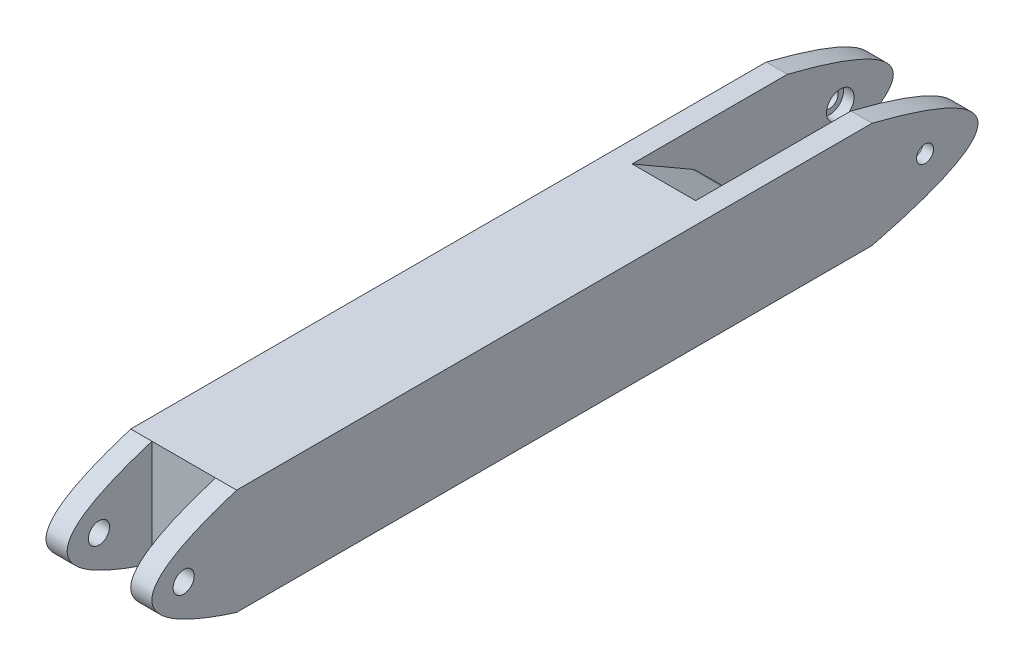
ISO-10303-21;
HEADER;
FILE_DESCRIPTION(('STEP AP214'),'2;1');
FILE_NAME('part.step','',(''),(''),'','','');
FILE_SCHEMA(('AUTOMOTIVE_DESIGN { 1 0 10303 214 1 1 1 1 }'));
ENDSEC;
DATA;
#1=APPLICATION_CONTEXT('core data for automotive mechanical design processes');
#2=APPLICATION_PROTOCOL_DEFINITION('international standard','automotive_design',2000,#1);
#3=PRODUCT_CONTEXT('',#1,'mechanical');
#4=PRODUCT('Part','Part','',(#3));
#5=PRODUCT_RELATED_PRODUCT_CATEGORY('part','',(#4));
#6=PRODUCT_DEFINITION_FORMATION('','',#4);
#7=PRODUCT_DEFINITION_CONTEXT('part definition',#1,'design');
#8=PRODUCT_DEFINITION('design','',#6,#7);
#9=PRODUCT_DEFINITION_SHAPE('','',#8);
#10=(LENGTH_UNIT() NAMED_UNIT(*) SI_UNIT(.MILLI.,.METRE.));
#11=(NAMED_UNIT(*) PLANE_ANGLE_UNIT() SI_UNIT($,.RADIAN.));
#12=(NAMED_UNIT(*) SI_UNIT($,.STERADIAN.) SOLID_ANGLE_UNIT());
#13=UNCERTAINTY_MEASURE_WITH_UNIT(LENGTH_MEASURE(1.E-05),#10,'distance_accuracy_value','');
#14=(GEOMETRIC_REPRESENTATION_CONTEXT(3) GLOBAL_UNCERTAINTY_ASSIGNED_CONTEXT((#13)) GLOBAL_UNIT_ASSIGNED_CONTEXT((#10,
#11,#12)) REPRESENTATION_CONTEXT('',''));
#15=CARTESIAN_POINT('',(0.,0.,0.));
#16=DIRECTION('',(0.,0.,1.));
#17=DIRECTION('',(1.,0.,0.));
#18=AXIS2_PLACEMENT_3D('',#15,#16,#17);
#19=CARTESIAN_POINT('',(50.,17.0460014069889,-69.1285010598986));
#20=DIRECTION('',(-1.,0.,0.));
#21=DIRECTION('',(0.,0.,1.));
#22=AXIS2_PLACEMENT_3D('',#19,#20,#21);
#23=CYLINDRICAL_SURFACE('',#22,4.00000000000002);
#24=CARTESIAN_POINT('',(0.,17.0460014069889,-69.1285010598986));
#25=DIRECTION('',(1.,0.,0.));
#26=DIRECTION('',(0.,0.,-1.));
#27=AXIS2_PLACEMENT_3D('',#24,#25,#26);
#28=CIRCLE('',#27,4.00000000000002);
#29=CARTESIAN_POINT('',(0.,17.0460014069889,-73.1285010598986));
#30=VERTEX_POINT('',#29);
#31=EDGE_CURVE('E221',#30,#30,#28,.T.);
#32=ORIENTED_EDGE('',*,*,#31,.F.);
#33=EDGE_LOOP('',(#32));
#34=FACE_BOUND('',#33,.T.);
#35=CARTESIAN_POINT('',(5.,17.0460014069889,-69.1285010598986));
#36=DIRECTION('',(1.,0.,0.));
#37=DIRECTION('',(0.,0.,-1.));
#38=AXIS2_PLACEMENT_3D('',#35,#36,#37);
#39=CIRCLE('',#38,4.00000000000002);
#40=CARTESIAN_POINT('',(5.,17.0460014069889,-73.1285010598986));
#41=VERTEX_POINT('',#40);
#42=EDGE_CURVE('E43',#41,#41,#39,.T.);
#43=ORIENTED_EDGE('',*,*,#42,.T.);
#44=EDGE_LOOP('',(#43));
#45=FACE_BOUND('',#44,.T.);
#46=ADVANCED_FACE('F39',(#34,#45),#23,.F.);
#47=CARTESIAN_POINT('',(50.,17.0460014069889,-69.1285010598986));
#48=DIRECTION('',(1.,0.,0.));
#49=DIRECTION('',(0.,0.,-1.));
#50=AXIS2_PLACEMENT_3D('',#47,#48,#49);
#51=CIRCLE('',#50,4.00000000000002);
#52=CARTESIAN_POINT('',(50.,17.0460014069889,-73.1285010598986));
#53=VERTEX_POINT('',#52);
#54=EDGE_CURVE('E222',#53,#53,#51,.T.);
#55=ORIENTED_EDGE('',*,*,#54,.T.);
#56=EDGE_LOOP('',(#55));
#57=FACE_BOUND('',#56,.T.);
#58=CARTESIAN_POINT('',(45.,17.0460014069889,-69.1285010598986));
#59=DIRECTION('',(-1.,0.,0.));
#60=DIRECTION('',(0.,0.,1.));
#61=AXIS2_PLACEMENT_3D('',#58,#59,#60);
#62=CIRCLE('',#61,4.00000000000002);
#63=CARTESIAN_POINT('',(45.,17.0460014069889,-65.1285010598986));
#64=VERTEX_POINT('',#63);
#65=EDGE_CURVE('E336',#64,#64,#62,.T.);
#66=ORIENTED_EDGE('',*,*,#65,.T.);
#67=EDGE_LOOP('',(#66));
#68=FACE_BOUND('',#67,.T.);
#69=ADVANCED_FACE('F402',(#57,#68),#23,.F.);
#70=CARTESIAN_POINT('',(50.,42.0460014069818,255.871498940101));
#71=DIRECTION('',(0.,-1.,0.));
#72=DIRECTION('',(0.,0.,-1.));
#73=AXIS2_PLACEMENT_3D('',#70,#71,#72);
#74=PLANE('',#73);
#75=DIRECTION('',(0.,0.,1.));
#76=VECTOR('',#75,1.);
#77=CARTESIAN_POINT('',(40.,42.0460014069818,255.871498940101));
#78=LINE('',#77,#76);
#79=CARTESIAN_POINT('',(40.,42.0460014069818,-44.1285010598986));
#80=VERTEX_POINT('',#79);
#81=CARTESIAN_POINT('',(40.,42.0460014069818,29.1727691293236));
#82=VERTEX_POINT('',#81);
#83=EDGE_CURVE('E193',#80,#82,#78,.T.);
#84=ORIENTED_EDGE('',*,*,#83,.T.);
#85=DIRECTION('',(-1.,0.,0.));
#86=VECTOR('',#85,1.);
#87=CARTESIAN_POINT('',(40.,42.0460014069818,29.1727691293236));
#88=LINE('',#87,#86);
#89=CARTESIAN_POINT('',(10.,42.0460014069818,29.1727691293236));
#90=VERTEX_POINT('',#89);
#91=EDGE_CURVE('E161',#82,#90,#88,.T.);
#92=ORIENTED_EDGE('',*,*,#91,.T.);
#93=DIRECTION('',(0.,0.,-1.));
#94=VECTOR('',#93,1.);
#95=CARTESIAN_POINT('',(10.,42.0460014069818,255.871498940101));
#96=LINE('',#95,#94);
#97=CARTESIAN_POINT('',(10.,42.0460014069818,-44.1285010598986));
#98=VERTEX_POINT('',#97);
#99=EDGE_CURVE('E141',#90,#98,#96,.T.);
#100=ORIENTED_EDGE('',*,*,#99,.T.);
#101=DIRECTION('',(-1.,0.,0.));
#102=VECTOR('',#101,1.);
#103=CARTESIAN_POINT('',(50.,42.0460014069818,-44.1285010598985));
#104=LINE('',#103,#102);
#105=CARTESIAN_POINT('',(0.,42.0460014069818,-44.1285010598985));
#106=VERTEX_POINT('',#105);
#107=EDGE_CURVE('E308',#98,#106,#104,.T.);
#108=ORIENTED_EDGE('',*,*,#107,.T.);
#109=DIRECTION('',(0.,0.,1.));
#110=VECTOR('',#109,1.);
#111=CARTESIAN_POINT('',(0.,42.0460014069818,255.871498940101));
#112=LINE('',#111,#110);
#113=CARTESIAN_POINT('',(0.,42.0460014069818,255.871498940101));
#114=VERTEX_POINT('',#113);
#115=EDGE_CURVE('E246',#106,#114,#112,.T.);
#116=ORIENTED_EDGE('',*,*,#115,.T.);
#117=DIRECTION('',(-1.,0.,0.));
#118=VECTOR('',#117,1.);
#119=CARTESIAN_POINT('',(50.,42.0460014069818,255.871498940101));
#120=LINE('',#119,#118);
#121=CARTESIAN_POINT('',(10.,42.0460014069818,255.871498940101));
#122=VERTEX_POINT('',#121);
#123=EDGE_CURVE('E279',#122,#114,#120,.T.);
#124=ORIENTED_EDGE('',*,*,#123,.F.);
#125=CARTESIAN_POINT('',(40.,42.0460014069818,255.871498940101));
#126=VERTEX_POINT('',#125);
#127=EDGE_CURVE('E309',#126,#122,#120,.T.);
#128=ORIENTED_EDGE('',*,*,#127,.F.);
#129=CARTESIAN_POINT('',(50.,42.0460014069818,255.871498940101));
#130=VERTEX_POINT('',#129);
#131=EDGE_CURVE('E304',#130,#126,#120,.T.);
#132=ORIENTED_EDGE('',*,*,#131,.F.);
#133=DIRECTION('',(0.,0.,1.));
#134=VECTOR('',#133,1.);
#135=CARTESIAN_POINT('',(50.,42.0460014069818,255.871498940101));
#136=LINE('',#135,#134);
#137=CARTESIAN_POINT('',(50.,42.0460014069818,-44.1285010598985));
#138=VERTEX_POINT('',#137);
#139=EDGE_CURVE('E273',#138,#130,#136,.T.);
#140=ORIENTED_EDGE('',*,*,#139,.F.);
#141=EDGE_CURVE('E310',#138,#80,#104,.T.);
#142=ORIENTED_EDGE('',*,*,#141,.T.);
#143=EDGE_LOOP('',(#84,#92,#100,#108,#116,#124,#128,#132,#140,#142));
#144=FACE_BOUND('',#143,.T.);
#145=ADVANCED_FACE('F265',(#144),#74,.F.);
#146=CARTESIAN_POINT('',(50.,42.0460014069818,255.871498940101));
#147=CARTESIAN_POINT('',(50.,17.0460014071354,335.871498940101));
#148=CARTESIAN_POINT('',(50.,-7.95399859301822,255.871498940101));
#149=B_SPLINE_CURVE_WITH_KNOTS('',2,(#146,#147,#148),.UNSPECIFIED.,.F.,.F.,(3,3),(0.,1.),.UNSPECIFIED.);
#150=DIRECTION('',(-1.,0.,0.));
#151=VECTOR('',#150,1.);
#152=SURFACE_OF_LINEAR_EXTRUSION('',#149,#151);
#153=DIRECTION('',(-1.,0.,0.));
#154=VECTOR('',#153,1.);
#155=CARTESIAN_POINT('',(50.,-7.95399859301822,255.871498940101));
#156=LINE('',#155,#154);
#157=CARTESIAN_POINT('',(10.,-7.95399859301822,255.871498940101));
#158=VERTEX_POINT('',#157);
#159=CARTESIAN_POINT('',(0.,-7.95399859301822,255.871498940101));
#160=VERTEX_POINT('',#159);
#161=EDGE_CURVE('E318',#158,#160,#156,.T.);
#162=ORIENTED_EDGE('',*,*,#161,.F.);
#163=CARTESIAN_POINT('',(10.,42.0460014069818,255.871498940101));
#164=CARTESIAN_POINT('',(10.,17.0460014071354,335.871498940101));
#165=CARTESIAN_POINT('',(10.,-7.95399859301822,255.871498940101));
#166=B_SPLINE_CURVE_WITH_KNOTS('',2,(#163,#164,#165),.UNSPECIFIED.,.F.,.F.,(3,3),(0.,1.),.UNSPECIFIED.);
#167=EDGE_CURVE('E185',#158,#122,#166,.F.);
#168=ORIENTED_EDGE('',*,*,#167,.T.);
#169=ORIENTED_EDGE('',*,*,#123,.T.);
#170=CARTESIAN_POINT('',(0.,42.0460014069818,255.871498940101));
#171=CARTESIAN_POINT('',(0.,17.0460014071354,335.871498940101));
#172=CARTESIAN_POINT('',(0.,-7.95399859301822,255.871498940101));
#173=B_SPLINE_CURVE_WITH_KNOTS('',2,(#170,#171,#172),.UNSPECIFIED.,.F.,.F.,(3,3),(0.,1.),.UNSPECIFIED.);
#174=EDGE_CURVE('E234',#114,#160,#173,.T.);
#175=ORIENTED_EDGE('',*,*,#174,.T.);
#176=EDGE_LOOP('',(#162,#168,#169,#175));
#177=FACE_BOUND('',#176,.T.);
#178=ADVANCED_FACE('F256',(#177),#152,.F.);
#179=CARTESIAN_POINT('',(50.,17.0460014070886,280.871498940101));
#180=DIRECTION('',(-1.,0.,0.));
#181=DIRECTION('',(0.,0.,1.));
#182=AXIS2_PLACEMENT_3D('',#179,#180,#181);
#183=CYLINDRICAL_SURFACE('',#182,4.99999999999999);
#184=CARTESIAN_POINT('',(10.,17.0460014070886,280.871498940101));
#185=DIRECTION('',(-1.,0.,0.));
#186=DIRECTION('',(0.,0.,1.));
#187=AXIS2_PLACEMENT_3D('',#184,#185,#186);
#188=CIRCLE('',#187,4.99999999999999);
#189=CARTESIAN_POINT('',(10.,17.0460014070886,285.871498940101));
#190=VERTEX_POINT('',#189);
#191=EDGE_CURVE('E184',#190,#190,#188,.T.);
#192=ORIENTED_EDGE('',*,*,#191,.F.);
#193=EDGE_LOOP('',(#192));
#194=FACE_BOUND('',#193,.T.);
#195=CARTESIAN_POINT('',(0.,17.0460014070886,280.871498940101));
#196=DIRECTION('',(1.,0.,0.));
#197=DIRECTION('',(0.,0.,-1.));
#198=AXIS2_PLACEMENT_3D('',#195,#196,#197);
#199=CIRCLE('',#198,4.99999999999999);
#200=CARTESIAN_POINT('',(0.,17.0460014070886,275.871498940101));
#201=VERTEX_POINT('',#200);
#202=EDGE_CURVE('E226',#201,#201,#199,.T.);
#203=ORIENTED_EDGE('',*,*,#202,.F.);
#204=EDGE_LOOP('',(#203));
#205=FACE_BOUND('',#204,.T.);
#206=ADVANCED_FACE('F478',(#194,#205),#183,.F.);
#207=CARTESIAN_POINT('',(50.,-7.95399859301822,-44.1285010598985));
#208=CARTESIAN_POINT('',(50.,17.0460014069818,-144.128501059899));
#209=CARTESIAN_POINT('',(50.,42.0460014069818,-44.1285010598985));
#210=B_SPLINE_CURVE_WITH_KNOTS('',2,(#207,#208,#209),.UNSPECIFIED.,.F.,.F.,(3,3),(0.,1.),.UNSPECIFIED.);
#211=DIRECTION('',(-1.,0.,0.));
#212=VECTOR('',#211,1.);
#213=SURFACE_OF_LINEAR_EXTRUSION('',#210,#212);
#214=ORIENTED_EDGE('',*,*,#107,.F.);
#215=CARTESIAN_POINT('',(10.,-7.95399859301822,-44.1285010598985));
#216=CARTESIAN_POINT('',(10.,17.0460014069818,-144.128501059899));
#217=CARTESIAN_POINT('',(10.,42.0460014069818,-44.1285010598985));
#218=B_SPLINE_CURVE_WITH_KNOTS('',2,(#215,#216,#217),.UNSPECIFIED.,.F.,.F.,(3,3),(0.,1.),.UNSPECIFIED.);
#219=CARTESIAN_POINT('',(10.,-7.95399859301822,-44.1285010598985));
#220=VERTEX_POINT('',#219);
#221=EDGE_CURVE('E210',#98,#220,#218,.F.);
#222=ORIENTED_EDGE('',*,*,#221,.T.);
#223=DIRECTION('',(-1.,0.,0.));
#224=VECTOR('',#223,1.);
#225=CARTESIAN_POINT('',(50.,-7.95399859301822,-44.1285010598985));
#226=LINE('',#225,#224);
#227=CARTESIAN_POINT('',(0.,-7.95399859301822,-44.1285010598985));
#228=VERTEX_POINT('',#227);
#229=EDGE_CURVE('E314',#220,#228,#226,.T.);
#230=ORIENTED_EDGE('',*,*,#229,.T.);
#231=CARTESIAN_POINT('',(0.,-7.95399859301822,-44.1285010598985));
#232=CARTESIAN_POINT('',(0.,17.0460014069818,-144.128501059899));
#233=CARTESIAN_POINT('',(0.,42.0460014069818,-44.1285010598985));
#234=B_SPLINE_CURVE_WITH_KNOTS('',2,(#231,#232,#233),.UNSPECIFIED.,.F.,.F.,(3,3),(0.,1.),.UNSPECIFIED.);
#235=EDGE_CURVE('E292',#228,#106,#234,.T.);
#236=ORIENTED_EDGE('',*,*,#235,.T.);
#237=EDGE_LOOP('',(#214,#222,#230,#236));
#238=FACE_BOUND('',#237,.T.);
#239=ADVANCED_FACE('F264',(#238),#213,.F.);
#240=CARTESIAN_POINT('',(50.,17.0460014070586,295.871498940101));
#241=DIRECTION('',(-1.,0.,0.));
#242=DIRECTION('',(0.,0.,1.));
#243=AXIS2_PLACEMENT_3D('',#240,#241,#242);
#244=PLANE('',#243);
#245=CARTESIAN_POINT('',(50.,-7.95399859301822,255.871498940101));
#246=VERTEX_POINT('',#245);
#247=EDGE_CURVE('E238',#130,#246,#149,.T.);
#248=ORIENTED_EDGE('',*,*,#247,.T.);
#249=DIRECTION('',(0.,0.,-1.));
#250=VECTOR('',#249,1.);
#251=CARTESIAN_POINT('',(50.,-7.95399859301822,255.871498940101));
#252=LINE('',#251,#250);
#253=CARTESIAN_POINT('',(50.,-7.95399859301822,-44.1285010598985));
#254=VERTEX_POINT('',#253);
#255=EDGE_CURVE('E245',#246,#254,#252,.T.);
#256=ORIENTED_EDGE('',*,*,#255,.T.);
#257=EDGE_CURVE('E267',#254,#138,#210,.T.);
#258=ORIENTED_EDGE('',*,*,#257,.T.);
#259=ORIENTED_EDGE('',*,*,#139,.T.);
#260=EDGE_LOOP('',(#248,#256,#258,#259));
#261=FACE_BOUND('',#260,.T.);
#262=CARTESIAN_POINT('',(50.,17.0460014070886,280.871498940101));
#263=DIRECTION('',(1.,0.,0.));
#264=DIRECTION('',(0.,0.,-1.));
#265=AXIS2_PLACEMENT_3D('',#262,#263,#264);
#266=CIRCLE('',#265,4.99999999999999);
#267=CARTESIAN_POINT('',(50.,17.0460014070886,275.871498940101));
#268=VERTEX_POINT('',#267);
#269=EDGE_CURVE('E230',#268,#268,#266,.T.);
#270=ORIENTED_EDGE('',*,*,#269,.F.);
#271=EDGE_LOOP('',(#270));
#272=FACE_BOUND('',#271,.T.);
#273=ORIENTED_EDGE('',*,*,#54,.F.);
#274=EDGE_LOOP('',(#273));
#275=FACE_BOUND('',#274,.T.);
#276=ADVANCED_FACE('F389',(#261,#272,#275),#244,.F.);
#277=CARTESIAN_POINT('',(0.,17.0460014070586,295.871498940101));
#278=DIRECTION('',(-1.,0.,0.));
#279=DIRECTION('',(0.,0.,1.));
#280=AXIS2_PLACEMENT_3D('',#277,#278,#279);
#281=PLANE('',#280);
#282=CARTESIAN_POINT('',(0.,27.0460014069889,15.8714989401014));
#283=DIRECTION('',(-1.,0.,0.));
#284=DIRECTION('',(0.,0.,1.));
#285=AXIS2_PLACEMENT_3D('',#282,#283,#284);
#286=CIRCLE('',#285,3.);
#287=CARTESIAN_POINT('',(0.,27.0460014069889,18.8714989401014));
#288=VERTEX_POINT('',#287);
#289=EDGE_CURVE('E370',#288,#288,#286,.T.);
#290=ORIENTED_EDGE('',*,*,#289,.F.);
#291=EDGE_LOOP('',(#290));
#292=FACE_BOUND('',#291,.T.);
#293=CARTESIAN_POINT('',(0.,7.0460014069889,15.8714989401014));
#294=DIRECTION('',(-1.,0.,0.));
#295=DIRECTION('',(0.,0.,-1.));
#296=AXIS2_PLACEMENT_3D('',#293,#294,#295);
#297=CIRCLE('',#296,3.);
#298=CARTESIAN_POINT('',(0.,7.0460014069889,12.8714989401014));
#299=VERTEX_POINT('',#298);
#300=EDGE_CURVE('E362',#299,#299,#297,.T.);
#301=ORIENTED_EDGE('',*,*,#300,.F.);
#302=EDGE_LOOP('',(#301));
#303=FACE_BOUND('',#302,.T.);
#304=ORIENTED_EDGE('',*,*,#202,.T.);
#305=EDGE_LOOP('',(#304));
#306=FACE_BOUND('',#305,.T.);
#307=ORIENTED_EDGE('',*,*,#174,.F.);
#308=ORIENTED_EDGE('',*,*,#115,.F.);
#309=ORIENTED_EDGE('',*,*,#235,.F.);
#310=DIRECTION('',(0.,0.,-1.));
#311=VECTOR('',#310,1.);
#312=CARTESIAN_POINT('',(0.,-7.95399859301822,255.871498940101));
#313=LINE('',#312,#311);
#314=EDGE_CURVE('E285',#160,#228,#313,.T.);
#315=ORIENTED_EDGE('',*,*,#314,.F.);
#316=EDGE_LOOP('',(#307,#308,#309,#315));
#317=FACE_BOUND('',#316,.T.);
#318=ORIENTED_EDGE('',*,*,#31,.T.);
#319=EDGE_LOOP('',(#318));
#320=FACE_BOUND('',#319,.T.);
#321=ADVANCED_FACE('F254',(#292,#303,#306,#317,#320),#281,.T.);
#322=ORIENTED_EDGE('',*,*,#131,.T.);
#323=CARTESIAN_POINT('',(40.,42.0460014069818,255.871498940101));
#324=CARTESIAN_POINT('',(40.,17.0460014071354,335.871498940101));
#325=CARTESIAN_POINT('',(40.,-7.95399859301822,255.871498940101));
#326=B_SPLINE_CURVE_WITH_KNOTS('',2,(#323,#324,#325),.UNSPECIFIED.,.F.,.F.,(3,3),(0.,1.),.UNSPECIFIED.);
#327=CARTESIAN_POINT('',(40.,-7.95399859301822,255.871498940101));
#328=VERTEX_POINT('',#327);
#329=EDGE_CURVE('E179',#126,#328,#326,.T.);
#330=ORIENTED_EDGE('',*,*,#329,.T.);
#331=EDGE_CURVE('E319',#246,#328,#156,.T.);
#332=ORIENTED_EDGE('',*,*,#331,.F.);
#333=ORIENTED_EDGE('',*,*,#247,.F.);
#334=EDGE_LOOP('',(#322,#330,#332,#333));
#335=FACE_BOUND('',#334,.T.);
#336=ADVANCED_FACE('F251',(#335),#152,.F.);
#337=CARTESIAN_POINT('',(50.,-7.95399859301822,255.871498940101));
#338=DIRECTION('',(0.,1.,0.));
#339=DIRECTION('',(0.,0.,1.));
#340=AXIS2_PLACEMENT_3D('',#337,#338,#339);
#341=PLANE('',#340);
#342=DIRECTION('',(-1.,0.,0.));
#343=VECTOR('',#342,1.);
#344=CARTESIAN_POINT('',(40.,-7.95399859301822,29.1727691293229));
#345=LINE('',#344,#343);
#346=CARTESIAN_POINT('',(40.,-7.95399859301822,29.1727691293229));
#347=VERTEX_POINT('',#346);
#348=CARTESIAN_POINT('',(10.,-7.95399859301822,29.1727691293229));
#349=VERTEX_POINT('',#348);
#350=EDGE_CURVE('E145',#347,#349,#345,.T.);
#351=ORIENTED_EDGE('',*,*,#350,.F.);
#352=DIRECTION('',(0.,0.,-1.));
#353=VECTOR('',#352,1.);
#354=CARTESIAN_POINT('',(40.,-7.95399859301822,255.871498940101));
#355=LINE('',#354,#353);
#356=CARTESIAN_POINT('',(40.,-7.95399859301822,-44.1285010598985));
#357=VERTEX_POINT('',#356);
#358=EDGE_CURVE('E130',#347,#357,#355,.T.);
#359=ORIENTED_EDGE('',*,*,#358,.T.);
#360=EDGE_CURVE('E315',#254,#357,#226,.T.);
#361=ORIENTED_EDGE('',*,*,#360,.F.);
#362=ORIENTED_EDGE('',*,*,#255,.F.);
#363=ORIENTED_EDGE('',*,*,#331,.T.);
#364=DIRECTION('',(1.,0.,0.));
#365=VECTOR('',#364,1.);
#366=CARTESIAN_POINT('',(10.,-7.95399859301822,255.871498940101));
#367=LINE('',#366,#365);
#368=EDGE_CURVE('E166',#158,#328,#367,.T.);
#369=ORIENTED_EDGE('',*,*,#368,.F.);
#370=ORIENTED_EDGE('',*,*,#161,.T.);
#371=ORIENTED_EDGE('',*,*,#314,.T.);
#372=ORIENTED_EDGE('',*,*,#229,.F.);
#373=DIRECTION('',(0.,0.,1.));
#374=VECTOR('',#373,1.);
#375=CARTESIAN_POINT('',(10.,-7.95399859301822,255.871498940101));
#376=LINE('',#375,#374);
#377=EDGE_CURVE('E151',#220,#349,#376,.T.);
#378=ORIENTED_EDGE('',*,*,#377,.T.);
#379=EDGE_LOOP('',(#351,#359,#361,#362,#363,#369,#370,#371,#372,#378));
#380=FACE_BOUND('',#379,.T.);
#381=ADVANCED_FACE('F149',(#380),#341,.F.);
#382=ORIENTED_EDGE('',*,*,#360,.T.);
#383=CARTESIAN_POINT('',(40.,-7.95399859301822,-44.1285010598985));
#384=CARTESIAN_POINT('',(40.,17.0460014069818,-144.128501059899));
#385=CARTESIAN_POINT('',(40.,42.0460014069818,-44.1285010598985));
#386=B_SPLINE_CURVE_WITH_KNOTS('',2,(#383,#384,#385),.UNSPECIFIED.,.F.,.F.,(3,3),(0.,1.),.UNSPECIFIED.);
#387=EDGE_CURVE('E135',#357,#80,#386,.T.);
#388=ORIENTED_EDGE('',*,*,#387,.T.);
#389=ORIENTED_EDGE('',*,*,#141,.F.);
#390=ORIENTED_EDGE('',*,*,#257,.F.);
#391=EDGE_LOOP('',(#382,#388,#389,#390));
#392=FACE_BOUND('',#391,.T.);
#393=ADVANCED_FACE('F259',(#392),#213,.F.);
#394=CARTESIAN_POINT('',(40.,17.0460014070886,280.871498940101));
#395=DIRECTION('',(1.,0.,0.));
#396=DIRECTION('',(0.,0.,-1.));
#397=AXIS2_PLACEMENT_3D('',#394,#395,#396);
#398=CIRCLE('',#397,4.99999999999999);
#399=CARTESIAN_POINT('',(40.,17.0460014070886,275.871498940101));
#400=VERTEX_POINT('',#399);
#401=EDGE_CURVE('E175',#400,#400,#398,.T.);
#402=ORIENTED_EDGE('',*,*,#401,.F.);
#403=EDGE_LOOP('',(#402));
#404=FACE_BOUND('',#403,.T.);
#405=ORIENTED_EDGE('',*,*,#269,.T.);
#406=EDGE_LOOP('',(#405));
#407=FACE_BOUND('',#406,.T.);
#408=ADVANCED_FACE('F262',(#404,#407),#183,.F.);
#409=CARTESIAN_POINT('',(10.,-35.,-94.1285010598986));
#410=DIRECTION('',(-1.,0.,0.));
#411=DIRECTION('',(0.,0.,1.));
#412=AXIS2_PLACEMENT_3D('',#409,#410,#411);
#413=PLANE('',#412);
#414=CARTESIAN_POINT('',(10.,17.0460014069889,-69.1285010598986));
#415=DIRECTION('',(1.,0.,0.));
#416=DIRECTION('',(0.,0.,-1.));
#417=AXIS2_PLACEMENT_3D('',#414,#415,#416);
#418=CIRCLE('',#417,6.49999999999783);
#419=CARTESIAN_POINT('',(10.,17.0460014069889,-75.6285010598964));
#420=VERTEX_POINT('',#419);
#421=EDGE_CURVE('E353',#420,#420,#418,.T.);
#422=ORIENTED_EDGE('',*,*,#421,.F.);
#423=EDGE_LOOP('',(#422));
#424=FACE_BOUND('',#423,.T.);
#425=ORIENTED_EDGE('',*,*,#221,.F.);
#426=ORIENTED_EDGE('',*,*,#99,.F.);
#427=DIRECTION('',(0.,0.499999999999998,0.86602540378444));
#428=VECTOR('',#427,1.);
#429=CARTESIAN_POINT('',(10.,17.0460014069818,-14.1285010598985));
#430=LINE('',#429,#428);
#431=CARTESIAN_POINT('',(10.,25.7062554448261,0.871498940101433));
#432=VERTEX_POINT('',#431);
#433=EDGE_CURVE('E153',#432,#90,#430,.T.);
#434=ORIENTED_EDGE('',*,*,#433,.F.);
#435=CARTESIAN_POINT('',(10.,17.0460014069817,5.87149894010141));
#436=DIRECTION('',(-1.,0.,0.));
#437=DIRECTION('',(0.,0.,1.));
#438=AXIS2_PLACEMENT_3D('',#435,#436,#437);
#439=CIRCLE('',#438,10.);
#440=CARTESIAN_POINT('',(10.,8.38574736913734,0.871498940101372));
#441=VERTEX_POINT('',#440);
#442=EDGE_CURVE('E49',#432,#441,#439,.T.);
#443=ORIENTED_EDGE('',*,*,#442,.T.);
#444=DIRECTION('',(0.,0.500000000000004,-0.866025403784436));
#445=VECTOR('',#444,1.);
#446=CARTESIAN_POINT('',(10.,17.0460014069818,-14.1285010598985));
#447=LINE('',#446,#445);
#448=EDGE_CURVE('E147',#349,#441,#447,.T.);
#449=ORIENTED_EDGE('',*,*,#448,.F.);
#450=ORIENTED_EDGE('',*,*,#377,.F.);
#451=EDGE_LOOP('',(#425,#426,#434,#443,#449,#450));
#452=FACE_BOUND('',#451,.T.);
#453=ADVANCED_FACE('F422',(#424,#452),#413,.F.);
#454=CARTESIAN_POINT('',(40.,-35.,-94.1285010598986));
#455=DIRECTION('',(1.,0.,0.));
#456=DIRECTION('',(0.,0.,-1.));
#457=AXIS2_PLACEMENT_3D('',#454,#455,#456);
#458=PLANE('',#457);
#459=CARTESIAN_POINT('',(40.,17.0460014069889,-69.1285010598986));
#460=DIRECTION('',(-1.,0.,0.));
#461=DIRECTION('',(0.,0.,1.));
#462=AXIS2_PLACEMENT_3D('',#459,#460,#461);
#463=CIRCLE('',#462,6.49999999999801);
#464=CARTESIAN_POINT('',(40.,17.0460014069889,-62.6285010599006));
#465=VERTEX_POINT('',#464);
#466=EDGE_CURVE('E345',#465,#465,#463,.T.);
#467=ORIENTED_EDGE('',*,*,#466,.F.);
#468=EDGE_LOOP('',(#467));
#469=FACE_BOUND('',#468,.T.);
#470=ORIENTED_EDGE('',*,*,#358,.F.);
#471=DIRECTION('',(0.,0.500000000000004,-0.866025403784436));
#472=VECTOR('',#471,1.);
#473=CARTESIAN_POINT('',(40.,17.0460014069818,-14.1285010598985));
#474=LINE('',#473,#472);
#475=CARTESIAN_POINT('',(40.,8.38574736913734,0.871498940101372));
#476=VERTEX_POINT('',#475);
#477=EDGE_CURVE('E132',#347,#476,#474,.T.);
#478=ORIENTED_EDGE('',*,*,#477,.T.);
#479=CARTESIAN_POINT('',(40.,17.0460014069817,5.87149894010141));
#480=DIRECTION('',(1.,0.,0.));
#481=DIRECTION('',(0.,0.,-1.));
#482=AXIS2_PLACEMENT_3D('',#479,#480,#481);
#483=CIRCLE('',#482,10.);
#484=CARTESIAN_POINT('',(40.,25.7062554448261,0.871498940101433));
#485=VERTEX_POINT('',#484);
#486=EDGE_CURVE('E11',#476,#485,#483,.T.);
#487=ORIENTED_EDGE('',*,*,#486,.T.);
#488=DIRECTION('',(0.,0.499999999999998,0.86602540378444));
#489=VECTOR('',#488,1.);
#490=CARTESIAN_POINT('',(40.,17.0460014069818,-14.1285010598985));
#491=LINE('',#490,#489);
#492=EDGE_CURVE('E156',#485,#82,#491,.T.);
#493=ORIENTED_EDGE('',*,*,#492,.T.);
#494=ORIENTED_EDGE('',*,*,#83,.F.);
#495=ORIENTED_EDGE('',*,*,#387,.F.);
#496=EDGE_LOOP('',(#470,#478,#487,#493,#494,#495));
#497=FACE_BOUND('',#496,.T.);
#498=ADVANCED_FACE('F131',(#469,#497),#458,.F.);
#499=CARTESIAN_POINT('',(10.,44.0460014069818,255.871498940101));
#500=DIRECTION('',(0.,0.,-1.));
#501=DIRECTION('',(-1.,0.,0.));
#502=AXIS2_PLACEMENT_3D('',#499,#500,#501);
#503=PLANE('',#502);
#504=DIRECTION('',(0.,-1.,0.));
#505=VECTOR('',#504,1.);
#506=CARTESIAN_POINT('',(10.,44.0460014069818,255.871498940101));
#507=LINE('',#506,#505);
#508=EDGE_CURVE('E170',#122,#158,#507,.T.);
#509=ORIENTED_EDGE('',*,*,#508,.T.);
#510=ORIENTED_EDGE('',*,*,#368,.T.);
#511=DIRECTION('',(0.,-1.,0.));
#512=VECTOR('',#511,1.);
#513=CARTESIAN_POINT('',(40.,44.0460014069818,255.871498940101));
#514=LINE('',#513,#512);
#515=EDGE_CURVE('E171',#126,#328,#514,.T.);
#516=ORIENTED_EDGE('',*,*,#515,.F.);
#517=ORIENTED_EDGE('',*,*,#127,.T.);
#518=EDGE_LOOP('',(#509,#510,#516,#517));
#519=FACE_BOUND('',#518,.T.);
#520=ADVANCED_FACE('F451',(#519),#503,.F.);
#521=CARTESIAN_POINT('',(10.,44.0460014069818,295.871498940101));
#522=DIRECTION('',(-1.,0.,0.));
#523=DIRECTION('',(0.,0.,1.));
#524=AXIS2_PLACEMENT_3D('',#521,#522,#523);
#525=PLANE('',#524);
#526=ORIENTED_EDGE('',*,*,#191,.T.);
#527=EDGE_LOOP('',(#526));
#528=FACE_BOUND('',#527,.T.);
#529=ORIENTED_EDGE('',*,*,#508,.F.);
#530=ORIENTED_EDGE('',*,*,#167,.F.);
#531=EDGE_LOOP('',(#529,#530));
#532=FACE_BOUND('',#531,.T.);
#533=ADVANCED_FACE('F456',(#528,#532),#525,.F.);
#534=CARTESIAN_POINT('',(40.,44.0460014069818,295.871498940101));
#535=DIRECTION('',(1.,0.,0.));
#536=DIRECTION('',(0.,0.,-1.));
#537=AXIS2_PLACEMENT_3D('',#534,#535,#536);
#538=PLANE('',#537);
#539=ORIENTED_EDGE('',*,*,#401,.T.);
#540=EDGE_LOOP('',(#539));
#541=FACE_BOUND('',#540,.T.);
#542=ORIENTED_EDGE('',*,*,#515,.T.);
#543=ORIENTED_EDGE('',*,*,#329,.F.);
#544=EDGE_LOOP('',(#542,#543));
#545=FACE_BOUND('',#544,.T.);
#546=ADVANCED_FACE('F458',(#541,#545),#538,.F.);
#547=CARTESIAN_POINT('',(40.,17.0460014069818,-14.1285010598985));
#548=DIRECTION('',(0.,-0.86602540378444,0.499999999999998));
#549=DIRECTION('',(0.,-0.499999999999998,-0.86602540378444));
#550=AXIS2_PLACEMENT_3D('',#547,#548,#549);
#551=PLANE('',#550);
#552=ORIENTED_EDGE('',*,*,#492,.F.);
#553=DIRECTION('',(-1.,0.,0.));
#554=VECTOR('',#553,1.);
#555=CARTESIAN_POINT('',(40.,25.7062554448261,0.871498940101436));
#556=LINE('',#555,#554);
#557=EDGE_CURVE('E323',#485,#432,#556,.T.);
#558=ORIENTED_EDGE('',*,*,#557,.T.);
#559=ORIENTED_EDGE('',*,*,#433,.T.);
#560=ORIENTED_EDGE('',*,*,#91,.F.);
#561=EDGE_LOOP('',(#552,#558,#559,#560));
#562=FACE_BOUND('',#561,.T.);
#563=ADVANCED_FACE('F465',(#562),#551,.F.);
#564=CARTESIAN_POINT('',(40.,17.0460014069818,-14.1285010598985));
#565=DIRECTION('',(0.,0.866025403784436,0.500000000000004));
#566=DIRECTION('',(0.,-0.500000000000004,0.866025403784436));
#567=AXIS2_PLACEMENT_3D('',#564,#565,#566);
#568=PLANE('',#567);
#569=ORIENTED_EDGE('',*,*,#448,.T.);
#570=DIRECTION('',(-1.,0.,0.));
#571=VECTOR('',#570,1.);
#572=CARTESIAN_POINT('',(40.,8.38574736913734,0.87149894010137));
#573=LINE('',#572,#571);
#574=EDGE_CURVE('E57',#441,#476,#573,.F.);
#575=ORIENTED_EDGE('',*,*,#574,.T.);
#576=ORIENTED_EDGE('',*,*,#477,.F.);
#577=ORIENTED_EDGE('',*,*,#350,.T.);
#578=EDGE_LOOP('',(#569,#575,#576,#577));
#579=FACE_BOUND('',#578,.T.);
#580=ADVANCED_FACE('F144',(#579),#568,.F.);
#581=CARTESIAN_POINT('',(40.,17.0460014069817,5.87149894010141));
#582=DIRECTION('',(-1.,0.,0.));
#583=DIRECTION('',(0.,0.,1.));
#584=AXIS2_PLACEMENT_3D('',#581,#582,#583);
#585=CYLINDRICAL_SURFACE('',#584,10.);
#586=ORIENTED_EDGE('',*,*,#486,.F.);
#587=ORIENTED_EDGE('',*,*,#574,.F.);
#588=ORIENTED_EDGE('',*,*,#442,.F.);
#589=ORIENTED_EDGE('',*,*,#557,.F.);
#590=EDGE_LOOP('',(#586,#587,#588,#589));
#591=FACE_BOUND('',#590,.T.);
#592=ADVANCED_FACE('F41',(#591),#585,.T.);
#593=CARTESIAN_POINT('',(45.,17.0460014069889,-69.1285010598986));
#594=DIRECTION('',(-1.,0.,0.));
#595=DIRECTION('',(0.,0.,1.));
#596=AXIS2_PLACEMENT_3D('',#593,#594,#595);
#597=CYLINDRICAL_SURFACE('',#596,6.49999999999801);
#598=CARTESIAN_POINT('',(45.,17.0460014069889,-69.1285010598986));
#599=DIRECTION('',(-1.,0.,0.));
#600=DIRECTION('',(0.,0.,1.));
#601=AXIS2_PLACEMENT_3D('',#598,#599,#600);
#602=CIRCLE('',#601,6.49999999999801);
#603=CARTESIAN_POINT('',(45.,17.0460014069889,-62.6285010599006));
#604=VERTEX_POINT('',#603);
#605=EDGE_CURVE('E339',#604,#604,#602,.T.);
#606=ORIENTED_EDGE('',*,*,#605,.F.);
#607=EDGE_LOOP('',(#606));
#608=FACE_BOUND('',#607,.T.);
#609=ORIENTED_EDGE('',*,*,#466,.T.);
#610=EDGE_LOOP('',(#609));
#611=FACE_BOUND('',#610,.T.);
#612=ADVANCED_FACE('F581',(#608,#611),#597,.F.);
#613=CARTESIAN_POINT('',(45.,17.0460014069889,-69.1285010598986));
#614=DIRECTION('',(-1.,0.,0.));
#615=DIRECTION('',(0.,0.,1.));
#616=AXIS2_PLACEMENT_3D('',#613,#614,#615);
#617=PLANE('',#616);
#618=ORIENTED_EDGE('',*,*,#65,.F.);
#619=EDGE_LOOP('',(#618));
#620=FACE_BOUND('',#619,.T.);
#621=ORIENTED_EDGE('',*,*,#605,.T.);
#622=EDGE_LOOP('',(#621));
#623=FACE_BOUND('',#622,.T.);
#624=ADVANCED_FACE('F418',(#620,#623),#617,.T.);
#625=CARTESIAN_POINT('',(5.,17.0460014069889,-69.1285010598986));
#626=DIRECTION('',(1.,0.,0.));
#627=DIRECTION('',(0.,0.,-1.));
#628=AXIS2_PLACEMENT_3D('',#625,#626,#627);
#629=CYLINDRICAL_SURFACE('',#628,6.49999999999783);
#630=CARTESIAN_POINT('',(5.,17.0460014069889,-69.1285010598986));
#631=DIRECTION('',(1.,0.,0.));
#632=DIRECTION('',(0.,0.,-1.));
#633=AXIS2_PLACEMENT_3D('',#630,#631,#632);
#634=CIRCLE('',#633,6.49999999999783);
#635=CARTESIAN_POINT('',(5.,17.0460014069889,-75.6285010598964));
#636=VERTEX_POINT('',#635);
#637=EDGE_CURVE('E357',#636,#636,#634,.T.);
#638=ORIENTED_EDGE('',*,*,#637,.F.);
#639=EDGE_LOOP('',(#638));
#640=FACE_BOUND('',#639,.T.);
#641=ORIENTED_EDGE('',*,*,#421,.T.);
#642=EDGE_LOOP('',(#641));
#643=FACE_BOUND('',#642,.T.);
#644=ADVANCED_FACE('F412',(#640,#643),#629,.F.);
#645=CARTESIAN_POINT('',(5.,17.0460014069889,-69.1285010598986));
#646=DIRECTION('',(1.,0.,0.));
#647=DIRECTION('',(0.,0.,-1.));
#648=AXIS2_PLACEMENT_3D('',#645,#646,#647);
#649=PLANE('',#648);
#650=ORIENTED_EDGE('',*,*,#42,.F.);
#651=EDGE_LOOP('',(#650));
#652=FACE_BOUND('',#651,.T.);
#653=ORIENTED_EDGE('',*,*,#637,.T.);
#654=EDGE_LOOP('',(#653));
#655=FACE_BOUND('',#654,.T.);
#656=ADVANCED_FACE('F408',(#652,#655),#649,.T.);
#657=CARTESIAN_POINT('',(16.,7.0460014069889,15.8714989401014));
#658=DIRECTION('',(-1.,0.,0.));
#659=DIRECTION('',(0.,0.,1.));
#660=AXIS2_PLACEMENT_3D('',#657,#658,#659);
#661=CYLINDRICAL_SURFACE('',#660,3.);
#662=CARTESIAN_POINT('',(16.,7.0460014069889,15.8714989401014));
#663=DIRECTION('',(-1.,0.,0.));
#664=DIRECTION('',(0.,0.,-1.));
#665=AXIS2_PLACEMENT_3D('',#662,#663,#664);
#666=CIRCLE('',#665,3.);
#667=CARTESIAN_POINT('',(16.,7.0460014069889,12.8714989401014));
#668=VERTEX_POINT('',#667);
#669=EDGE_CURVE('E366',#668,#668,#666,.T.);
#670=ORIENTED_EDGE('',*,*,#669,.F.);
#671=EDGE_LOOP('',(#670));
#672=FACE_BOUND('',#671,.T.);
#673=ORIENTED_EDGE('',*,*,#300,.T.);
#674=EDGE_LOOP('',(#673));
#675=FACE_BOUND('',#674,.T.);
#676=ADVANCED_FACE('F411',(#672,#675),#661,.F.);
#677=CARTESIAN_POINT('',(16.,7.0460014069889,15.8714989401014));
#678=DIRECTION('',(1.,0.,0.));
#679=DIRECTION('',(0.,0.,-1.));
#680=AXIS2_PLACEMENT_3D('',#677,#678,#679);
#681=PLANE('',#680);
#682=ORIENTED_EDGE('',*,*,#669,.T.);
#683=EDGE_LOOP('',(#682));
#684=FACE_BOUND('',#683,.T.);
#685=ADVANCED_FACE('F383',(#684),#681,.F.);
#686=CARTESIAN_POINT('',(16.,27.0460014069889,15.8714989401014));
#687=DIRECTION('',(-1.,0.,0.));
#688=DIRECTION('',(0.,0.,1.));
#689=AXIS2_PLACEMENT_3D('',#686,#687,#688);
#690=CYLINDRICAL_SURFACE('',#689,3.);
#691=CARTESIAN_POINT('',(16.,27.0460014069889,15.8714989401014));
#692=DIRECTION('',(-1.,0.,0.));
#693=DIRECTION('',(0.,0.,1.));
#694=AXIS2_PLACEMENT_3D('',#691,#692,#693);
#695=CIRCLE('',#694,3.);
#696=CARTESIAN_POINT('',(16.,27.0460014069889,18.8714989401014));
#697=VERTEX_POINT('',#696);
#698=EDGE_CURVE('E358',#697,#697,#695,.T.);
#699=ORIENTED_EDGE('',*,*,#698,.F.);
#700=EDGE_LOOP('',(#699));
#701=FACE_BOUND('',#700,.T.);
#702=ORIENTED_EDGE('',*,*,#289,.T.);
#703=EDGE_LOOP('',(#702));
#704=FACE_BOUND('',#703,.T.);
#705=ADVANCED_FACE('F380',(#701,#704),#690,.F.);
#706=CARTESIAN_POINT('',(16.,27.0460014069889,15.8714989401014));
#707=DIRECTION('',(-1.,0.,0.));
#708=DIRECTION('',(0.,0.,1.));
#709=AXIS2_PLACEMENT_3D('',#706,#707,#708);
#710=PLANE('',#709);
#711=ORIENTED_EDGE('',*,*,#698,.T.);
#712=EDGE_LOOP('',(#711));
#713=FACE_BOUND('',#712,.T.);
#714=ADVANCED_FACE('F378',(#713),#710,.T.);
#715=CLOSED_SHELL('',(#46,#69,#145,#178,#206,#239,#276,#321,#336,#381,#393,#408,#453,#498,#520,
#533,#546,#563,#580,#592,#612,#624,#644,#656,#676,#685,#705,#714));
#716=MANIFOLD_SOLID_BREP('B2',#715);
#717=ADVANCED_BREP_SHAPE_REPRESENTATION('',(#18,#716),#14);
#718=SHAPE_DEFINITION_REPRESENTATION(#9,#717);
ENDSEC;
END-ISO-10303-21;
